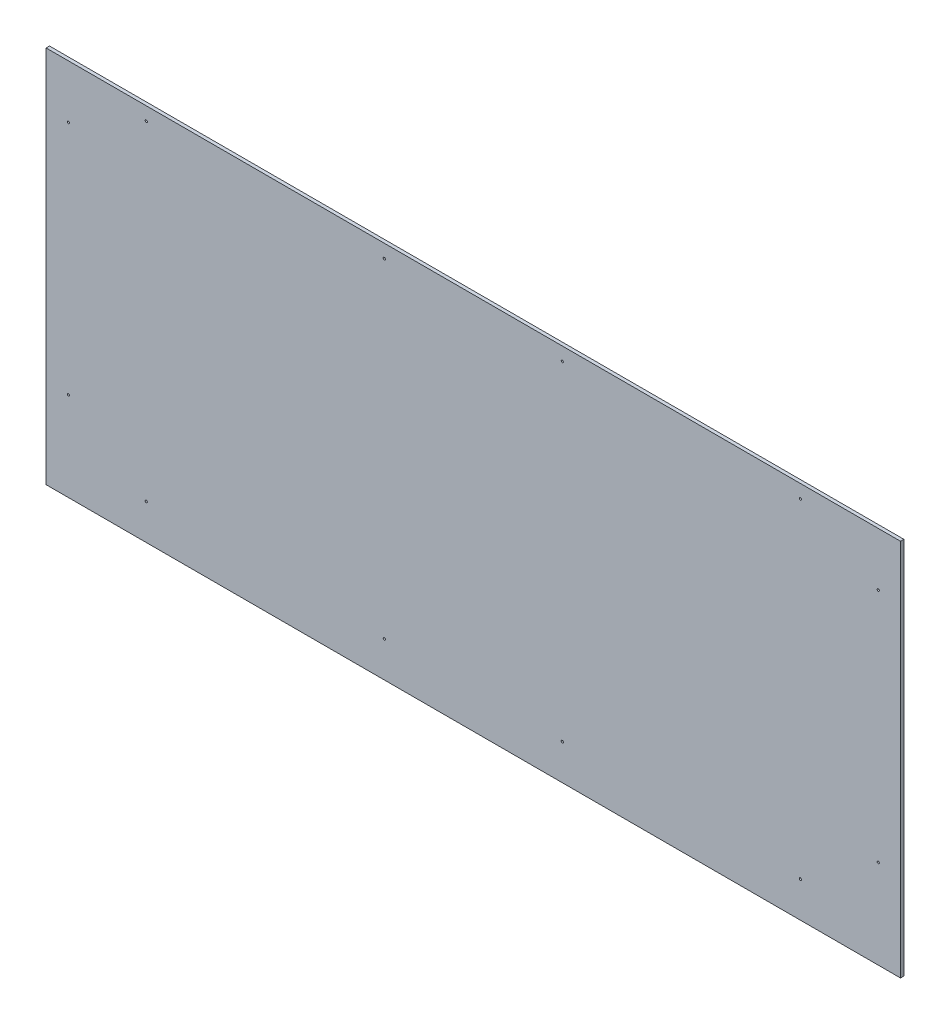
ISO-10303-21;
HEADER;
FILE_DESCRIPTION(('STEP AP214'),'2;1');
FILE_NAME('part.step','',(''),(''),'','','');
FILE_SCHEMA(('AUTOMOTIVE_DESIGN { 1 0 10303 214 1 1 1 1 }'));
ENDSEC;
DATA;
#1=APPLICATION_CONTEXT('core data for automotive mechanical design processes');
#2=APPLICATION_PROTOCOL_DEFINITION('international standard','automotive_design',2000,#1);
#3=PRODUCT_CONTEXT('',#1,'mechanical');
#4=PRODUCT('Part','Part','',(#3));
#5=PRODUCT_RELATED_PRODUCT_CATEGORY('part','',(#4));
#6=PRODUCT_DEFINITION_FORMATION('','',#4);
#7=PRODUCT_DEFINITION_CONTEXT('part definition',#1,'design');
#8=PRODUCT_DEFINITION('design','',#6,#7);
#9=PRODUCT_DEFINITION_SHAPE('','',#8);
#10=(LENGTH_UNIT() NAMED_UNIT(*) SI_UNIT(.MILLI.,.METRE.));
#11=(NAMED_UNIT(*) PLANE_ANGLE_UNIT() SI_UNIT($,.RADIAN.));
#12=(NAMED_UNIT(*) SI_UNIT($,.STERADIAN.) SOLID_ANGLE_UNIT());
#13=UNCERTAINTY_MEASURE_WITH_UNIT(LENGTH_MEASURE(1.E-05),#10,'distance_accuracy_value','');
#14=(GEOMETRIC_REPRESENTATION_CONTEXT(3) GLOBAL_UNCERTAINTY_ASSIGNED_CONTEXT((#13)) GLOBAL_UNIT_ASSIGNED_CONTEXT((#10,
#11,#12)) REPRESENTATION_CONTEXT('',''));
#15=CARTESIAN_POINT('',(0.,0.,0.));
#16=DIRECTION('',(0.,0.,1.));
#17=DIRECTION('',(1.,0.,0.));
#18=AXIS2_PLACEMENT_3D('',#15,#16,#17);
#19=CARTESIAN_POINT('',(0.,0.,1071.626));
#20=DIRECTION('',(0.,0.,1.));
#21=DIRECTION('',(1.,0.,0.));
#22=AXIS2_PLACEMENT_3D('',#19,#20,#21);
#23=PLANE('',#22);
#24=CARTESIAN_POINT('',(-466.725,19.05,1071.626));
#25=DIRECTION('',(0.,0.,1.));
#26=DIRECTION('',(1.,0.,0.));
#27=AXIS2_PLACEMENT_3D('',#24,#25,#26);
#28=CIRCLE('',#27,1.5875);
#29=CARTESIAN_POINT('',(-465.1375,19.05,1071.626));
#30=VERTEX_POINT('',#29);
#31=EDGE_CURVE('E98',#30,#30,#28,.F.);
#32=ORIENTED_EDGE('',*,*,#31,.T.);
#33=EDGE_LOOP('',(#32));
#34=FACE_BOUND('',#33,.T.);
#35=CARTESIAN_POINT('',(-127.,19.05,1071.626));
#36=DIRECTION('',(0.,0.,1.));
#37=DIRECTION('',(1.,0.,0.));
#38=AXIS2_PLACEMENT_3D('',#35,#36,#37);
#39=CIRCLE('',#38,1.5875);
#40=CARTESIAN_POINT('',(-125.4125,19.05,1071.626));
#41=VERTEX_POINT('',#40);
#42=EDGE_CURVE('E117',#41,#41,#39,.F.);
#43=ORIENTED_EDGE('',*,*,#42,.T.);
#44=EDGE_LOOP('',(#43));
#45=FACE_BOUND('',#44,.T.);
#46=CARTESIAN_POINT('',(127.,19.05,1071.626));
#47=DIRECTION('',(0.,0.,1.));
#48=DIRECTION('',(1.,0.,0.));
#49=AXIS2_PLACEMENT_3D('',#46,#47,#48);
#50=CIRCLE('',#49,1.5875);
#51=CARTESIAN_POINT('',(128.5875,19.05,1071.626));
#52=VERTEX_POINT('',#51);
#53=EDGE_CURVE('E120',#52,#52,#50,.F.);
#54=ORIENTED_EDGE('',*,*,#53,.T.);
#55=EDGE_LOOP('',(#54));
#56=FACE_BOUND('',#55,.T.);
#57=CARTESIAN_POINT('',(466.725,19.05,1071.626));
#58=DIRECTION('',(0.,0.,1.));
#59=DIRECTION('',(1.,0.,0.));
#60=AXIS2_PLACEMENT_3D('',#57,#58,#59);
#61=CIRCLE('',#60,1.5875);
#62=CARTESIAN_POINT('',(468.3125,19.05,1071.626));
#63=VERTEX_POINT('',#62);
#64=EDGE_CURVE('E123',#63,#63,#61,.F.);
#65=ORIENTED_EDGE('',*,*,#64,.T.);
#66=EDGE_LOOP('',(#65));
#67=FACE_BOUND('',#66,.T.);
#68=CARTESIAN_POINT('',(127.,-450.85,1071.626));
#69=DIRECTION('',(0.,0.,1.));
#70=DIRECTION('',(1.,0.,0.));
#71=AXIS2_PLACEMENT_3D('',#68,#69,#70);
#72=CIRCLE('',#71,1.5875);
#73=CARTESIAN_POINT('',(128.5875,-450.85,1071.626));
#74=VERTEX_POINT('',#73);
#75=EDGE_CURVE('E126',#74,#74,#72,.F.);
#76=ORIENTED_EDGE('',*,*,#75,.T.);
#77=EDGE_LOOP('',(#76));
#78=FACE_BOUND('',#77,.T.);
#79=CARTESIAN_POINT('',(-127.,-450.85,1071.626));
#80=DIRECTION('',(0.,0.,1.));
#81=DIRECTION('',(1.,0.,0.));
#82=AXIS2_PLACEMENT_3D('',#79,#80,#81);
#83=CIRCLE('',#82,1.5875);
#84=CARTESIAN_POINT('',(-125.4125,-450.85,1071.626));
#85=VERTEX_POINT('',#84);
#86=EDGE_CURVE('E129',#85,#85,#83,.F.);
#87=ORIENTED_EDGE('',*,*,#86,.T.);
#88=EDGE_LOOP('',(#87));
#89=FACE_BOUND('',#88,.T.);
#90=CARTESIAN_POINT('',(577.85,-38.1,1071.626));
#91=DIRECTION('',(0.,0.,1.));
#92=DIRECTION('',(1.,0.,0.));
#93=AXIS2_PLACEMENT_3D('',#90,#91,#92);
#94=CIRCLE('',#93,1.5875);
#95=CARTESIAN_POINT('',(579.4375,-38.1,1071.626));
#96=VERTEX_POINT('',#95);
#97=EDGE_CURVE('E132',#96,#96,#94,.F.);
#98=ORIENTED_EDGE('',*,*,#97,.T.);
#99=EDGE_LOOP('',(#98));
#100=FACE_BOUND('',#99,.T.);
#101=CARTESIAN_POINT('',(577.85,-374.65,1071.626));
#102=DIRECTION('',(0.,0.,1.));
#103=DIRECTION('',(1.,0.,0.));
#104=AXIS2_PLACEMENT_3D('',#101,#102,#103);
#105=CIRCLE('',#104,1.5875);
#106=CARTESIAN_POINT('',(579.4375,-374.65,1071.626));
#107=VERTEX_POINT('',#106);
#108=EDGE_CURVE('E135',#107,#107,#105,.F.);
#109=ORIENTED_EDGE('',*,*,#108,.T.);
#110=EDGE_LOOP('',(#109));
#111=FACE_BOUND('',#110,.T.);
#112=CARTESIAN_POINT('',(466.725,-450.85,1071.626));
#113=DIRECTION('',(0.,0.,1.));
#114=DIRECTION('',(1.,0.,0.));
#115=AXIS2_PLACEMENT_3D('',#112,#113,#114);
#116=CIRCLE('',#115,1.5875);
#117=CARTESIAN_POINT('',(468.3125,-450.85,1071.626));
#118=VERTEX_POINT('',#117);
#119=EDGE_CURVE('E138',#118,#118,#116,.F.);
#120=ORIENTED_EDGE('',*,*,#119,.T.);
#121=EDGE_LOOP('',(#120));
#122=FACE_BOUND('',#121,.T.);
#123=CARTESIAN_POINT('',(-466.725,-450.85,1071.626));
#124=DIRECTION('',(0.,0.,1.));
#125=DIRECTION('',(1.,0.,0.));
#126=AXIS2_PLACEMENT_3D('',#123,#124,#125);
#127=CIRCLE('',#126,1.5875);
#128=CARTESIAN_POINT('',(-465.1375,-450.85,1071.626));
#129=VERTEX_POINT('',#128);
#130=EDGE_CURVE('E141',#129,#129,#127,.F.);
#131=ORIENTED_EDGE('',*,*,#130,.T.);
#132=EDGE_LOOP('',(#131));
#133=FACE_BOUND('',#132,.T.);
#134=CARTESIAN_POINT('',(-577.85,-374.65,1071.626));
#135=DIRECTION('',(0.,0.,1.));
#136=DIRECTION('',(1.,0.,0.));
#137=AXIS2_PLACEMENT_3D('',#134,#135,#136);
#138=CIRCLE('',#137,1.5875);
#139=CARTESIAN_POINT('',(-576.2625,-374.65,1071.626));
#140=VERTEX_POINT('',#139);
#141=EDGE_CURVE('E143',#140,#140,#138,.F.);
#142=ORIENTED_EDGE('',*,*,#141,.T.);
#143=EDGE_LOOP('',(#142));
#144=FACE_BOUND('',#143,.T.);
#145=CARTESIAN_POINT('',(-577.85,-38.1,1071.626));
#146=DIRECTION('',(0.,0.,1.));
#147=DIRECTION('',(1.,0.,0.));
#148=AXIS2_PLACEMENT_3D('',#145,#146,#147);
#149=CIRCLE('',#148,1.5875);
#150=CARTESIAN_POINT('',(-576.2625,-38.1,1071.626));
#151=VERTEX_POINT('',#150);
#152=EDGE_CURVE('E22',#151,#151,#149,.F.);
#153=ORIENTED_EDGE('',*,*,#152,.T.);
#154=EDGE_LOOP('',(#153));
#155=FACE_BOUND('',#154,.T.);
#156=DIRECTION('',(1.,0.,0.));
#157=VECTOR('',#156,1.);
#158=CARTESIAN_POINT('',(609.6,38.1,1071.626));
#159=LINE('',#158,#157);
#160=CARTESIAN_POINT('',(-609.6,38.1,1071.626));
#161=VERTEX_POINT('',#160);
#162=CARTESIAN_POINT('',(609.6,38.1,1071.626));
#163=VERTEX_POINT('',#162);
#164=EDGE_CURVE('E73',#161,#163,#159,.T.);
#165=ORIENTED_EDGE('',*,*,#164,.F.);
#166=DIRECTION('',(0.,1.,0.));
#167=VECTOR('',#166,1.);
#168=CARTESIAN_POINT('',(-609.6,38.1,1071.626));
#169=LINE('',#168,#167);
#170=CARTESIAN_POINT('',(-609.6,-501.65,1071.626));
#171=VERTEX_POINT('',#170);
#172=EDGE_CURVE('E70',#171,#161,#169,.T.);
#173=ORIENTED_EDGE('',*,*,#172,.F.);
#174=DIRECTION('',(1.,0.,0.));
#175=VECTOR('',#174,1.);
#176=CARTESIAN_POINT('',(-609.6,-501.65,1071.626));
#177=LINE('',#176,#175);
#178=CARTESIAN_POINT('',(609.6,-501.65,1071.626));
#179=VERTEX_POINT('',#178);
#180=EDGE_CURVE('E61',#179,#171,#177,.F.);
#181=ORIENTED_EDGE('',*,*,#180,.F.);
#182=DIRECTION('',(0.,1.,0.));
#183=VECTOR('',#182,1.);
#184=CARTESIAN_POINT('',(609.6,-501.65,1071.626));
#185=LINE('',#184,#183);
#186=EDGE_CURVE('E56',#163,#179,#185,.F.);
#187=ORIENTED_EDGE('',*,*,#186,.F.);
#188=EDGE_LOOP('',(#165,#173,#181,#187));
#189=FACE_BOUND('',#188,.T.);
#190=ADVANCED_FACE('F19',(#34,#45,#56,#67,#78,#89,#100,#111,#122,#133,#144,#155,#189),#23,.T.);
#191=CARTESIAN_POINT('',(-609.6,38.1,1066.8));
#192=DIRECTION('',(-1.,0.,0.));
#193=DIRECTION('',(0.,0.,1.));
#194=AXIS2_PLACEMENT_3D('',#191,#192,#193);
#195=PLANE('',#194);
#196=DIRECTION('',(0.,0.,1.));
#197=VECTOR('',#196,1.);
#198=CARTESIAN_POINT('',(-609.6,38.1,1066.8));
#199=LINE('',#198,#197);
#200=CARTESIAN_POINT('',(-609.6,38.1,1066.8));
#201=VERTEX_POINT('',#200);
#202=EDGE_CURVE('E90',#201,#161,#199,.T.);
#203=ORIENTED_EDGE('',*,*,#202,.F.);
#204=DIRECTION('',(0.,1.,0.));
#205=VECTOR('',#204,1.);
#206=CARTESIAN_POINT('',(-609.6,0.,1066.8));
#207=LINE('',#206,#205);
#208=CARTESIAN_POINT('',(-609.6,-501.65,1066.8));
#209=VERTEX_POINT('',#208);
#210=EDGE_CURVE('E80',#201,#209,#207,.F.);
#211=ORIENTED_EDGE('',*,*,#210,.T.);
#212=DIRECTION('',(0.,0.,-1.));
#213=VECTOR('',#212,1.);
#214=CARTESIAN_POINT('',(-609.6,-501.65,1066.8));
#215=LINE('',#214,#213);
#216=EDGE_CURVE('E66',#171,#209,#215,.T.);
#217=ORIENTED_EDGE('',*,*,#216,.F.);
#218=ORIENTED_EDGE('',*,*,#172,.T.);
#219=EDGE_LOOP('',(#203,#211,#217,#218));
#220=FACE_BOUND('',#219,.T.);
#221=ADVANCED_FACE('F79',(#220),#195,.T.);
#222=CARTESIAN_POINT('',(-609.6,-501.65,1066.8));
#223=DIRECTION('',(0.,-1.,0.));
#224=DIRECTION('',(0.,0.,-1.));
#225=AXIS2_PLACEMENT_3D('',#222,#223,#224);
#226=PLANE('',#225);
#227=ORIENTED_EDGE('',*,*,#216,.T.);
#228=DIRECTION('',(1.,0.,0.));
#229=VECTOR('',#228,1.);
#230=CARTESIAN_POINT('',(0.,-501.65,1066.8));
#231=LINE('',#230,#229);
#232=CARTESIAN_POINT('',(609.6,-501.65,1066.8));
#233=VERTEX_POINT('',#232);
#234=EDGE_CURVE('E97',#209,#233,#231,.T.);
#235=ORIENTED_EDGE('',*,*,#234,.T.);
#236=DIRECTION('',(0.,0.,-1.));
#237=VECTOR('',#236,1.);
#238=CARTESIAN_POINT('',(609.6,-501.65,1066.8));
#239=LINE('',#238,#237);
#240=EDGE_CURVE('E68',#179,#233,#239,.T.);
#241=ORIENTED_EDGE('',*,*,#240,.F.);
#242=ORIENTED_EDGE('',*,*,#180,.T.);
#243=EDGE_LOOP('',(#227,#235,#241,#242));
#244=FACE_BOUND('',#243,.T.);
#245=ADVANCED_FACE('F63',(#244),#226,.T.);
#246=CARTESIAN_POINT('',(609.6,-501.65,1066.8));
#247=DIRECTION('',(1.,0.,0.));
#248=DIRECTION('',(0.,0.,-1.));
#249=AXIS2_PLACEMENT_3D('',#246,#247,#248);
#250=PLANE('',#249);
#251=ORIENTED_EDGE('',*,*,#240,.T.);
#252=DIRECTION('',(0.,1.,0.));
#253=VECTOR('',#252,1.);
#254=CARTESIAN_POINT('',(609.6,0.,1066.8));
#255=LINE('',#254,#253);
#256=CARTESIAN_POINT('',(609.6,38.1,1066.8));
#257=VERTEX_POINT('',#256);
#258=EDGE_CURVE('E99',#233,#257,#255,.T.);
#259=ORIENTED_EDGE('',*,*,#258,.T.);
#260=DIRECTION('',(0.,0.,1.));
#261=VECTOR('',#260,1.);
#262=CARTESIAN_POINT('',(609.6,38.1,1066.8));
#263=LINE('',#262,#261);
#264=EDGE_CURVE('E37',#163,#257,#263,.F.);
#265=ORIENTED_EDGE('',*,*,#264,.F.);
#266=ORIENTED_EDGE('',*,*,#186,.T.);
#267=EDGE_LOOP('',(#251,#259,#265,#266));
#268=FACE_BOUND('',#267,.T.);
#269=ADVANCED_FACE('F164',(#268),#250,.T.);
#270=CARTESIAN_POINT('',(609.6,38.1,1066.8));
#271=DIRECTION('',(0.,1.,0.));
#272=DIRECTION('',(0.,0.,1.));
#273=AXIS2_PLACEMENT_3D('',#270,#271,#272);
#274=PLANE('',#273);
#275=ORIENTED_EDGE('',*,*,#264,.T.);
#276=DIRECTION('',(1.,0.,0.));
#277=VECTOR('',#276,1.);
#278=CARTESIAN_POINT('',(0.,38.1,1066.8));
#279=LINE('',#278,#277);
#280=EDGE_CURVE('E103',#257,#201,#279,.F.);
#281=ORIENTED_EDGE('',*,*,#280,.T.);
#282=ORIENTED_EDGE('',*,*,#202,.T.);
#283=ORIENTED_EDGE('',*,*,#164,.T.);
#284=EDGE_LOOP('',(#275,#281,#282,#283));
#285=FACE_BOUND('',#284,.T.);
#286=ADVANCED_FACE('F154',(#285),#274,.T.);
#287=CARTESIAN_POINT('',(-577.85,-38.1,1071.626));
#288=DIRECTION('',(0.,0.,1.));
#289=DIRECTION('',(1.,0.,0.));
#290=AXIS2_PLACEMENT_3D('',#287,#288,#289);
#291=CYLINDRICAL_SURFACE('',#290,1.5875);
#292=ORIENTED_EDGE('',*,*,#152,.F.);
#293=EDGE_LOOP('',(#292));
#294=FACE_BOUND('',#293,.T.);
#295=CARTESIAN_POINT('',(-577.85,-38.1,1066.8));
#296=DIRECTION('',(0.,0.,1.));
#297=DIRECTION('',(1.,0.,0.));
#298=AXIS2_PLACEMENT_3D('',#295,#296,#297);
#299=CIRCLE('',#298,1.5875);
#300=CARTESIAN_POINT('',(-576.2625,-38.1,1066.8));
#301=VERTEX_POINT('',#300);
#302=EDGE_CURVE('E104',#301,#301,#299,.F.);
#303=ORIENTED_EDGE('',*,*,#302,.T.);
#304=EDGE_LOOP('',(#303));
#305=FACE_BOUND('',#304,.T.);
#306=ADVANCED_FACE('F151',(#294,#305),#291,.F.);
#307=CARTESIAN_POINT('',(-577.85,-374.65,1071.626));
#308=DIRECTION('',(0.,0.,1.));
#309=DIRECTION('',(1.,0.,0.));
#310=AXIS2_PLACEMENT_3D('',#307,#308,#309);
#311=CYLINDRICAL_SURFACE('',#310,1.5875);
#312=ORIENTED_EDGE('',*,*,#141,.F.);
#313=EDGE_LOOP('',(#312));
#314=FACE_BOUND('',#313,.T.);
#315=CARTESIAN_POINT('',(-577.85,-374.65,1066.8));
#316=DIRECTION('',(0.,0.,1.));
#317=DIRECTION('',(1.,0.,0.));
#318=AXIS2_PLACEMENT_3D('',#315,#316,#317);
#319=CIRCLE('',#318,1.5875);
#320=CARTESIAN_POINT('',(-576.2625,-374.65,1066.8));
#321=VERTEX_POINT('',#320);
#322=EDGE_CURVE('E106',#321,#321,#319,.F.);
#323=ORIENTED_EDGE('',*,*,#322,.T.);
#324=EDGE_LOOP('',(#323));
#325=FACE_BOUND('',#324,.T.);
#326=ADVANCED_FACE('F153',(#314,#325),#311,.F.);
#327=CARTESIAN_POINT('',(-466.725,-450.85,1071.626));
#328=DIRECTION('',(0.,0.,1.));
#329=DIRECTION('',(1.,0.,0.));
#330=AXIS2_PLACEMENT_3D('',#327,#328,#329);
#331=CYLINDRICAL_SURFACE('',#330,1.5875);
#332=ORIENTED_EDGE('',*,*,#130,.F.);
#333=EDGE_LOOP('',(#332));
#334=FACE_BOUND('',#333,.T.);
#335=CARTESIAN_POINT('',(-466.725,-450.85,1066.8));
#336=DIRECTION('',(0.,0.,1.));
#337=DIRECTION('',(1.,0.,0.));
#338=AXIS2_PLACEMENT_3D('',#335,#336,#337);
#339=CIRCLE('',#338,1.5875);
#340=CARTESIAN_POINT('',(-465.1375,-450.85,1066.8));
#341=VERTEX_POINT('',#340);
#342=EDGE_CURVE('E111',#341,#341,#339,.F.);
#343=ORIENTED_EDGE('',*,*,#342,.T.);
#344=EDGE_LOOP('',(#343));
#345=FACE_BOUND('',#344,.T.);
#346=ADVANCED_FACE('F161',(#334,#345),#331,.F.);
#347=CARTESIAN_POINT('',(466.725,-450.85,1071.626));
#348=DIRECTION('',(0.,0.,1.));
#349=DIRECTION('',(1.,0.,0.));
#350=AXIS2_PLACEMENT_3D('',#347,#348,#349);
#351=CYLINDRICAL_SURFACE('',#350,1.5875);
#352=ORIENTED_EDGE('',*,*,#119,.F.);
#353=EDGE_LOOP('',(#352));
#354=FACE_BOUND('',#353,.T.);
#355=CARTESIAN_POINT('',(466.725,-450.85,1066.8));
#356=DIRECTION('',(0.,0.,1.));
#357=DIRECTION('',(1.,0.,0.));
#358=AXIS2_PLACEMENT_3D('',#355,#356,#357);
#359=CIRCLE('',#358,1.5875);
#360=CARTESIAN_POINT('',(468.3125,-450.85,1066.8));
#361=VERTEX_POINT('',#360);
#362=EDGE_CURVE('E220',#361,#361,#359,.F.);
#363=ORIENTED_EDGE('',*,*,#362,.T.);
#364=EDGE_LOOP('',(#363));
#365=FACE_BOUND('',#364,.T.);
#366=ADVANCED_FACE('F206',(#354,#365),#351,.F.);
#367=CARTESIAN_POINT('',(577.85,-374.65,1071.626));
#368=DIRECTION('',(0.,0.,1.));
#369=DIRECTION('',(1.,0.,0.));
#370=AXIS2_PLACEMENT_3D('',#367,#368,#369);
#371=CYLINDRICAL_SURFACE('',#370,1.5875);
#372=ORIENTED_EDGE('',*,*,#108,.F.);
#373=EDGE_LOOP('',(#372));
#374=FACE_BOUND('',#373,.T.);
#375=CARTESIAN_POINT('',(577.85,-374.65,1066.8));
#376=DIRECTION('',(0.,0.,1.));
#377=DIRECTION('',(1.,0.,0.));
#378=AXIS2_PLACEMENT_3D('',#375,#376,#377);
#379=CIRCLE('',#378,1.5875);
#380=CARTESIAN_POINT('',(579.4375,-374.65,1066.8));
#381=VERTEX_POINT('',#380);
#382=EDGE_CURVE('E222',#381,#381,#379,.F.);
#383=ORIENTED_EDGE('',*,*,#382,.T.);
#384=EDGE_LOOP('',(#383));
#385=FACE_BOUND('',#384,.T.);
#386=ADVANCED_FACE('F202',(#374,#385),#371,.F.);
#387=CARTESIAN_POINT('',(577.85,-38.1,1071.626));
#388=DIRECTION('',(0.,0.,1.));
#389=DIRECTION('',(1.,0.,0.));
#390=AXIS2_PLACEMENT_3D('',#387,#388,#389);
#391=CYLINDRICAL_SURFACE('',#390,1.5875);
#392=ORIENTED_EDGE('',*,*,#97,.F.);
#393=EDGE_LOOP('',(#392));
#394=FACE_BOUND('',#393,.T.);
#395=CARTESIAN_POINT('',(577.85,-38.1,1066.8));
#396=DIRECTION('',(0.,0.,1.));
#397=DIRECTION('',(1.,0.,0.));
#398=AXIS2_PLACEMENT_3D('',#395,#396,#397);
#399=CIRCLE('',#398,1.5875);
#400=CARTESIAN_POINT('',(579.4375,-38.1,1066.8));
#401=VERTEX_POINT('',#400);
#402=EDGE_CURVE('E227',#401,#401,#399,.F.);
#403=ORIENTED_EDGE('',*,*,#402,.T.);
#404=EDGE_LOOP('',(#403));
#405=FACE_BOUND('',#404,.T.);
#406=ADVANCED_FACE('F198',(#394,#405),#391,.F.);
#407=CARTESIAN_POINT('',(-127.,-450.85,1071.626));
#408=DIRECTION('',(0.,0.,1.));
#409=DIRECTION('',(1.,0.,0.));
#410=AXIS2_PLACEMENT_3D('',#407,#408,#409);
#411=CYLINDRICAL_SURFACE('',#410,1.5875);
#412=ORIENTED_EDGE('',*,*,#86,.F.);
#413=EDGE_LOOP('',(#412));
#414=FACE_BOUND('',#413,.T.);
#415=CARTESIAN_POINT('',(-127.,-450.85,1066.8));
#416=DIRECTION('',(0.,0.,1.));
#417=DIRECTION('',(1.,0.,0.));
#418=AXIS2_PLACEMENT_3D('',#415,#416,#417);
#419=CIRCLE('',#418,1.5875);
#420=CARTESIAN_POINT('',(-125.4125,-450.85,1066.8));
#421=VERTEX_POINT('',#420);
#422=EDGE_CURVE('E230',#421,#421,#419,.F.);
#423=ORIENTED_EDGE('',*,*,#422,.T.);
#424=EDGE_LOOP('',(#423));
#425=FACE_BOUND('',#424,.T.);
#426=ADVANCED_FACE('F194',(#414,#425),#411,.F.);
#427=CARTESIAN_POINT('',(127.,-450.85,1071.626));
#428=DIRECTION('',(0.,0.,1.));
#429=DIRECTION('',(1.,0.,0.));
#430=AXIS2_PLACEMENT_3D('',#427,#428,#429);
#431=CYLINDRICAL_SURFACE('',#430,1.5875);
#432=ORIENTED_EDGE('',*,*,#75,.F.);
#433=EDGE_LOOP('',(#432));
#434=FACE_BOUND('',#433,.T.);
#435=CARTESIAN_POINT('',(127.,-450.85,1066.8));
#436=DIRECTION('',(0.,0.,1.));
#437=DIRECTION('',(1.,0.,0.));
#438=AXIS2_PLACEMENT_3D('',#435,#436,#437);
#439=CIRCLE('',#438,1.5875);
#440=CARTESIAN_POINT('',(128.5875,-450.85,1066.8));
#441=VERTEX_POINT('',#440);
#442=EDGE_CURVE('E233',#441,#441,#439,.F.);
#443=ORIENTED_EDGE('',*,*,#442,.T.);
#444=EDGE_LOOP('',(#443));
#445=FACE_BOUND('',#444,.T.);
#446=ADVANCED_FACE('F190',(#434,#445),#431,.F.);
#447=CARTESIAN_POINT('',(466.725,19.05,1071.626));
#448=DIRECTION('',(0.,0.,1.));
#449=DIRECTION('',(1.,0.,0.));
#450=AXIS2_PLACEMENT_3D('',#447,#448,#449);
#451=CYLINDRICAL_SURFACE('',#450,1.5875);
#452=ORIENTED_EDGE('',*,*,#64,.F.);
#453=EDGE_LOOP('',(#452));
#454=FACE_BOUND('',#453,.T.);
#455=CARTESIAN_POINT('',(466.725,19.05,1066.8));
#456=DIRECTION('',(0.,0.,1.));
#457=DIRECTION('',(1.,0.,0.));
#458=AXIS2_PLACEMENT_3D('',#455,#456,#457);
#459=CIRCLE('',#458,1.5875);
#460=CARTESIAN_POINT('',(468.3125,19.05,1066.8));
#461=VERTEX_POINT('',#460);
#462=EDGE_CURVE('E236',#461,#461,#459,.F.);
#463=ORIENTED_EDGE('',*,*,#462,.T.);
#464=EDGE_LOOP('',(#463));
#465=FACE_BOUND('',#464,.T.);
#466=ADVANCED_FACE('F186',(#454,#465),#451,.F.);
#467=CARTESIAN_POINT('',(127.,19.05,1071.626));
#468=DIRECTION('',(0.,0.,1.));
#469=DIRECTION('',(1.,0.,0.));
#470=AXIS2_PLACEMENT_3D('',#467,#468,#469);
#471=CYLINDRICAL_SURFACE('',#470,1.5875);
#472=ORIENTED_EDGE('',*,*,#53,.F.);
#473=EDGE_LOOP('',(#472));
#474=FACE_BOUND('',#473,.T.);
#475=CARTESIAN_POINT('',(127.,19.05,1066.8));
#476=DIRECTION('',(0.,0.,1.));
#477=DIRECTION('',(1.,0.,0.));
#478=AXIS2_PLACEMENT_3D('',#475,#476,#477);
#479=CIRCLE('',#478,1.5875);
#480=CARTESIAN_POINT('',(128.5875,19.05,1066.8));
#481=VERTEX_POINT('',#480);
#482=EDGE_CURVE('E239',#481,#481,#479,.F.);
#483=ORIENTED_EDGE('',*,*,#482,.T.);
#484=EDGE_LOOP('',(#483));
#485=FACE_BOUND('',#484,.T.);
#486=ADVANCED_FACE('F182',(#474,#485),#471,.F.);
#487=CARTESIAN_POINT('',(-127.,19.05,1071.626));
#488=DIRECTION('',(0.,0.,1.));
#489=DIRECTION('',(1.,0.,0.));
#490=AXIS2_PLACEMENT_3D('',#487,#488,#489);
#491=CYLINDRICAL_SURFACE('',#490,1.5875);
#492=ORIENTED_EDGE('',*,*,#42,.F.);
#493=EDGE_LOOP('',(#492));
#494=FACE_BOUND('',#493,.T.);
#495=CARTESIAN_POINT('',(-127.,19.05,1066.8));
#496=DIRECTION('',(0.,0.,1.));
#497=DIRECTION('',(1.,0.,0.));
#498=AXIS2_PLACEMENT_3D('',#495,#496,#497);
#499=CIRCLE('',#498,1.5875);
#500=CARTESIAN_POINT('',(-125.4125,19.05,1066.8));
#501=VERTEX_POINT('',#500);
#502=EDGE_CURVE('E28',#501,#501,#499,.F.);
#503=ORIENTED_EDGE('',*,*,#502,.T.);
#504=EDGE_LOOP('',(#503));
#505=FACE_BOUND('',#504,.T.);
#506=ADVANCED_FACE('F174',(#494,#505),#491,.F.);
#507=CARTESIAN_POINT('',(-466.725,19.05,1071.626));
#508=DIRECTION('',(0.,0.,1.));
#509=DIRECTION('',(1.,0.,0.));
#510=AXIS2_PLACEMENT_3D('',#507,#508,#509);
#511=CYLINDRICAL_SURFACE('',#510,1.5875);
#512=ORIENTED_EDGE('',*,*,#31,.F.);
#513=EDGE_LOOP('',(#512));
#514=FACE_BOUND('',#513,.T.);
#515=CARTESIAN_POINT('',(-466.725,19.05,1066.8));
#516=DIRECTION('',(0.,0.,1.));
#517=DIRECTION('',(1.,0.,0.));
#518=AXIS2_PLACEMENT_3D('',#515,#516,#517);
#519=CIRCLE('',#518,1.5875);
#520=CARTESIAN_POINT('',(-465.1375,19.05,1066.8));
#521=VERTEX_POINT('',#520);
#522=EDGE_CURVE('E12',#521,#521,#519,.F.);
#523=ORIENTED_EDGE('',*,*,#522,.T.);
#524=EDGE_LOOP('',(#523));
#525=FACE_BOUND('',#524,.T.);
#526=ADVANCED_FACE('F168',(#514,#525),#511,.F.);
#527=CARTESIAN_POINT('',(0.,0.,1066.8));
#528=DIRECTION('',(0.,0.,1.));
#529=DIRECTION('',(1.,0.,0.));
#530=AXIS2_PLACEMENT_3D('',#527,#528,#529);
#531=PLANE('',#530);
#532=ORIENTED_EDGE('',*,*,#522,.F.);
#533=EDGE_LOOP('',(#532));
#534=FACE_BOUND('',#533,.T.);
#535=ORIENTED_EDGE('',*,*,#502,.F.);
#536=EDGE_LOOP('',(#535));
#537=FACE_BOUND('',#536,.T.);
#538=ORIENTED_EDGE('',*,*,#482,.F.);
#539=EDGE_LOOP('',(#538));
#540=FACE_BOUND('',#539,.T.);
#541=ORIENTED_EDGE('',*,*,#462,.F.);
#542=EDGE_LOOP('',(#541));
#543=FACE_BOUND('',#542,.T.);
#544=ORIENTED_EDGE('',*,*,#442,.F.);
#545=EDGE_LOOP('',(#544));
#546=FACE_BOUND('',#545,.T.);
#547=ORIENTED_EDGE('',*,*,#422,.F.);
#548=EDGE_LOOP('',(#547));
#549=FACE_BOUND('',#548,.T.);
#550=ORIENTED_EDGE('',*,*,#402,.F.);
#551=EDGE_LOOP('',(#550));
#552=FACE_BOUND('',#551,.T.);
#553=ORIENTED_EDGE('',*,*,#382,.F.);
#554=EDGE_LOOP('',(#553));
#555=FACE_BOUND('',#554,.T.);
#556=ORIENTED_EDGE('',*,*,#362,.F.);
#557=EDGE_LOOP('',(#556));
#558=FACE_BOUND('',#557,.T.);
#559=ORIENTED_EDGE('',*,*,#342,.F.);
#560=EDGE_LOOP('',(#559));
#561=FACE_BOUND('',#560,.T.);
#562=ORIENTED_EDGE('',*,*,#322,.F.);
#563=EDGE_LOOP('',(#562));
#564=FACE_BOUND('',#563,.T.);
#565=ORIENTED_EDGE('',*,*,#302,.F.);
#566=EDGE_LOOP('',(#565));
#567=FACE_BOUND('',#566,.T.);
#568=ORIENTED_EDGE('',*,*,#258,.F.);
#569=ORIENTED_EDGE('',*,*,#234,.F.);
#570=ORIENTED_EDGE('',*,*,#210,.F.);
#571=ORIENTED_EDGE('',*,*,#280,.F.);
#572=EDGE_LOOP('',(#568,#569,#570,#571));
#573=FACE_BOUND('',#572,.T.);
#574=ADVANCED_FACE('F166',(#534,#537,#540,#543,#546,#549,#552,#555,#558,#561,#564,#567,#573),
#531,.F.);
#575=CLOSED_SHELL('',(#190,#221,#245,#269,#286,#306,#326,#346,#366,#386,#406,#426,#446,#466,
#486,#506,#526,#574));
#576=MANIFOLD_SOLID_BREP('B1',#575);
#577=ADVANCED_BREP_SHAPE_REPRESENTATION('',(#18,#576),#14);
#578=SHAPE_DEFINITION_REPRESENTATION(#9,#577);
ENDSEC;
END-ISO-10303-21;
